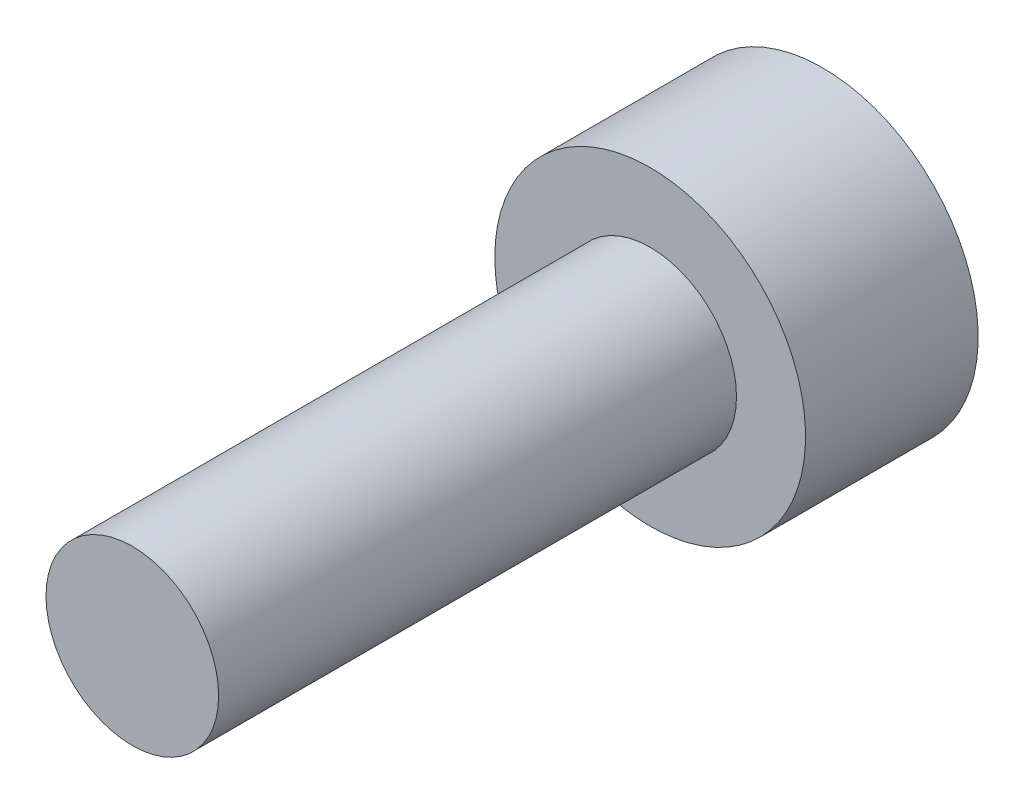
ISO-10303-21;
HEADER;
FILE_DESCRIPTION(('STEP AP214'),'2;1');
FILE_NAME('part.step','',(''),(''),'','','');
FILE_SCHEMA(('AUTOMOTIVE_DESIGN { 1 0 10303 214 1 1 1 1 }'));
ENDSEC;
DATA;
#1=APPLICATION_CONTEXT('core data for automotive mechanical design processes');
#2=APPLICATION_PROTOCOL_DEFINITION('international standard','automotive_design',2000,#1);
#3=PRODUCT_CONTEXT('',#1,'mechanical');
#4=PRODUCT('Part','Part','',(#3));
#5=PRODUCT_RELATED_PRODUCT_CATEGORY('part','',(#4));
#6=PRODUCT_DEFINITION_FORMATION('','',#4);
#7=PRODUCT_DEFINITION_CONTEXT('part definition',#1,'design');
#8=PRODUCT_DEFINITION('design','',#6,#7);
#9=PRODUCT_DEFINITION_SHAPE('','',#8);
#10=(LENGTH_UNIT() NAMED_UNIT(*) SI_UNIT(.MILLI.,.METRE.));
#11=(NAMED_UNIT(*) PLANE_ANGLE_UNIT() SI_UNIT($,.RADIAN.));
#12=(NAMED_UNIT(*) SI_UNIT($,.STERADIAN.) SOLID_ANGLE_UNIT());
#13=UNCERTAINTY_MEASURE_WITH_UNIT(LENGTH_MEASURE(1.E-05),#10,'distance_accuracy_value','');
#14=(GEOMETRIC_REPRESENTATION_CONTEXT(3) GLOBAL_UNCERTAINTY_ASSIGNED_CONTEXT((#13)) GLOBAL_UNIT_ASSIGNED_CONTEXT((#10,
#11,#12)) REPRESENTATION_CONTEXT('',''));
#15=CARTESIAN_POINT('',(0.,0.,0.));
#16=DIRECTION('',(0.,0.,1.));
#17=DIRECTION('',(1.,0.,0.));
#18=AXIS2_PLACEMENT_3D('',#15,#16,#17);
#19=CARTESIAN_POINT('',(0.,0.,15.));
#20=DIRECTION('',(0.,0.,-1.));
#21=DIRECTION('',(-1.,0.,0.));
#22=AXIS2_PLACEMENT_3D('',#19,#20,#21);
#23=CYLINDRICAL_SURFACE('',#22,2.5);
#24=CARTESIAN_POINT('',(0.,0.,15.));
#25=DIRECTION('',(0.,0.,1.));
#26=DIRECTION('',(1.,0.,0.));
#27=AXIS2_PLACEMENT_3D('',#24,#25,#26);
#28=CIRCLE('',#27,2.5);
#29=CARTESIAN_POINT('',(2.5,0.,15.));
#30=VERTEX_POINT('',#29);
#31=EDGE_CURVE('E11',#30,#30,#28,.T.);
#32=ORIENTED_EDGE('',*,*,#31,.F.);
#33=EDGE_LOOP('',(#32));
#34=FACE_BOUND('',#33,.T.);
#35=CARTESIAN_POINT('',(0.,0.,0.));
#36=DIRECTION('',(0.,0.,-1.));
#37=DIRECTION('',(-1.,0.,0.));
#38=AXIS2_PLACEMENT_3D('',#35,#36,#37);
#39=CIRCLE('',#38,2.5);
#40=CARTESIAN_POINT('',(-2.5,0.,0.));
#41=VERTEX_POINT('',#40);
#42=EDGE_CURVE('E53',#41,#41,#39,.T.);
#43=ORIENTED_EDGE('',*,*,#42,.F.);
#44=EDGE_LOOP('',(#43));
#45=FACE_BOUND('',#44,.T.);
#46=ADVANCED_FACE('F45',(#34,#45),#23,.T.);
#47=CARTESIAN_POINT('',(0.,0.,15.));
#48=DIRECTION('',(0.,0.,1.));
#49=DIRECTION('',(1.,0.,0.));
#50=AXIS2_PLACEMENT_3D('',#47,#48,#49);
#51=PLANE('',#50);
#52=ORIENTED_EDGE('',*,*,#31,.T.);
#53=EDGE_LOOP('',(#52));
#54=FACE_BOUND('',#53,.T.);
#55=ADVANCED_FACE('F182',(#54),#51,.T.);
#56=CARTESIAN_POINT('',(0.,0.,0.));
#57=DIRECTION('',(0.,0.,-1.));
#58=DIRECTION('',(-1.,0.,0.));
#59=AXIS2_PLACEMENT_3D('',#56,#57,#58);
#60=PLANE('',#59);
#61=CARTESIAN_POINT('',(0.,0.,0.));
#62=DIRECTION('',(0.,0.,-1.));
#63=DIRECTION('',(-1.,0.,0.));
#64=AXIS2_PLACEMENT_3D('',#61,#62,#63);
#65=CIRCLE('',#64,4.5);
#66=CARTESIAN_POINT('',(-4.5,0.,0.));
#67=VERTEX_POINT('',#66);
#68=EDGE_CURVE('E160',#67,#67,#65,.T.);
#69=ORIENTED_EDGE('',*,*,#68,.F.);
#70=EDGE_LOOP('',(#69));
#71=FACE_BOUND('',#70,.T.);
#72=ORIENTED_EDGE('',*,*,#42,.T.);
#73=EDGE_LOOP('',(#72));
#74=FACE_BOUND('',#73,.T.);
#75=ADVANCED_FACE('F179',(#71,#74),#60,.F.);
#76=CARTESIAN_POINT('',(0.,0.,-5.));
#77=DIRECTION('',(0.,0.,1.));
#78=DIRECTION('',(1.,0.,0.));
#79=AXIS2_PLACEMENT_3D('',#76,#77,#78);
#80=CYLINDRICAL_SURFACE('',#79,4.5);
#81=CARTESIAN_POINT('',(0.,0.,-5.));
#82=DIRECTION('',(0.,0.,-1.));
#83=DIRECTION('',(-1.,0.,0.));
#84=AXIS2_PLACEMENT_3D('',#81,#82,#83);
#85=CIRCLE('',#84,4.5);
#86=CARTESIAN_POINT('',(-4.5,0.,-5.));
#87=VERTEX_POINT('',#86);
#88=EDGE_CURVE('E170',#87,#87,#85,.T.);
#89=ORIENTED_EDGE('',*,*,#88,.F.);
#90=EDGE_LOOP('',(#89));
#91=FACE_BOUND('',#90,.T.);
#92=ORIENTED_EDGE('',*,*,#68,.T.);
#93=EDGE_LOOP('',(#92));
#94=FACE_BOUND('',#93,.T.);
#95=ADVANCED_FACE('F192',(#91,#94),#80,.T.);
#96=CARTESIAN_POINT('',(0.,0.,-5.));
#97=DIRECTION('',(0.,0.,-1.));
#98=DIRECTION('',(-1.,0.,0.));
#99=AXIS2_PLACEMENT_3D('',#96,#97,#98);
#100=PLANE('',#99);
#101=DIRECTION('',(0.866025403784439,0.5,0.));
#102=VECTOR('',#101,1.);
#103=CARTESIAN_POINT('',(-2.5,1.44337567297407,-5.));
#104=LINE('',#103,#102);
#105=CARTESIAN_POINT('',(-2.5,1.44337567297407,-5.));
#106=VERTEX_POINT('',#105);
#107=CARTESIAN_POINT('',(0.,2.88675134594813,-5.));
#108=VERTEX_POINT('',#107);
#109=EDGE_CURVE('E60',#106,#108,#104,.T.);
#110=ORIENTED_EDGE('',*,*,#109,.F.);
#111=DIRECTION('',(0.,1.,0.));
#112=VECTOR('',#111,1.);
#113=CARTESIAN_POINT('',(-2.5,-1.44337567297407,-5.));
#114=LINE('',#113,#112);
#115=CARTESIAN_POINT('',(-2.5,-1.44337567297407,-5.));
#116=VERTEX_POINT('',#115);
#117=EDGE_CURVE('E154',#116,#106,#114,.T.);
#118=ORIENTED_EDGE('',*,*,#117,.F.);
#119=DIRECTION('',(-0.866025403784439,0.5,0.));
#120=VECTOR('',#119,1.);
#121=CARTESIAN_POINT('',(0.,-2.88675134594813,-5.));
#122=LINE('',#121,#120);
#123=CARTESIAN_POINT('',(0.,-2.88675134594813,-5.));
#124=VERTEX_POINT('',#123);
#125=EDGE_CURVE('E151',#124,#116,#122,.T.);
#126=ORIENTED_EDGE('',*,*,#125,.F.);
#127=DIRECTION('',(-0.866025403784439,-0.5,0.));
#128=VECTOR('',#127,1.);
#129=CARTESIAN_POINT('',(2.5,-1.44337567297407,-5.));
#130=LINE('',#129,#128);
#131=CARTESIAN_POINT('',(2.5,-1.44337567297407,-5.));
#132=VERTEX_POINT('',#131);
#133=EDGE_CURVE('E108',#132,#124,#130,.T.);
#134=ORIENTED_EDGE('',*,*,#133,.F.);
#135=DIRECTION('',(0.,-1.,0.));
#136=VECTOR('',#135,1.);
#137=CARTESIAN_POINT('',(2.5,1.44337567297406,-5.));
#138=LINE('',#137,#136);
#139=CARTESIAN_POINT('',(2.5,1.44337567297406,-5.));
#140=VERTEX_POINT('',#139);
#141=EDGE_CURVE('E145',#140,#132,#138,.T.);
#142=ORIENTED_EDGE('',*,*,#141,.F.);
#143=DIRECTION('',(0.866025403784439,-0.5,0.));
#144=VECTOR('',#143,1.);
#145=CARTESIAN_POINT('',(0.,2.88675134594813,-5.));
#146=LINE('',#145,#144);
#147=EDGE_CURVE('E141',#108,#140,#146,.T.);
#148=ORIENTED_EDGE('',*,*,#147,.F.);
#149=EDGE_LOOP('',(#110,#118,#126,#134,#142,#148));
#150=FACE_BOUND('',#149,.T.);
#151=ORIENTED_EDGE('',*,*,#88,.T.);
#152=EDGE_LOOP('',(#151));
#153=FACE_BOUND('',#152,.T.);
#154=ADVANCED_FACE('F197',(#150,#153),#100,.T.);
#155=CARTESIAN_POINT('',(-2.5,1.44337567297407,-2.1));
#156=DIRECTION('',(-0.5,0.866025403784439,0.));
#157=DIRECTION('',(-0.866025403784439,-0.5,0.));
#158=AXIS2_PLACEMENT_3D('',#155,#156,#157);
#159=PLANE('',#158);
#160=ORIENTED_EDGE('',*,*,#109,.T.);
#161=DIRECTION('',(0.,0.,-1.));
#162=VECTOR('',#161,1.);
#163=CARTESIAN_POINT('',(0.,2.88675134594813,-2.1));
#164=LINE('',#163,#162);
#165=CARTESIAN_POINT('',(0.,2.88675134594813,-2.1));
#166=VERTEX_POINT('',#165);
#167=EDGE_CURVE('E90',#166,#108,#164,.T.);
#168=ORIENTED_EDGE('',*,*,#167,.F.);
#169=DIRECTION('',(0.866025403784439,0.5,0.));
#170=VECTOR('',#169,1.);
#171=CARTESIAN_POINT('',(-2.5,1.44337567297407,-2.1));
#172=LINE('',#171,#170);
#173=CARTESIAN_POINT('',(-2.5,1.44337567297407,-2.1));
#174=VERTEX_POINT('',#173);
#175=EDGE_CURVE('E157',#174,#166,#172,.T.);
#176=ORIENTED_EDGE('',*,*,#175,.F.);
#177=DIRECTION('',(0.,0.,-1.));
#178=VECTOR('',#177,1.);
#179=CARTESIAN_POINT('',(-2.5,1.44337567297407,-2.1));
#180=LINE('',#179,#178);
#181=EDGE_CURVE('E68',#174,#106,#180,.T.);
#182=ORIENTED_EDGE('',*,*,#181,.T.);
#183=EDGE_LOOP('',(#160,#168,#176,#182));
#184=FACE_BOUND('',#183,.T.);
#185=ADVANCED_FACE('F202',(#184),#159,.F.);
#186=CARTESIAN_POINT('',(-2.5,-1.44337567297407,-2.1));
#187=DIRECTION('',(-1.,0.,0.));
#188=DIRECTION('',(0.,-1.,0.));
#189=AXIS2_PLACEMENT_3D('',#186,#187,#188);
#190=PLANE('',#189);
#191=ORIENTED_EDGE('',*,*,#117,.T.);
#192=ORIENTED_EDGE('',*,*,#181,.F.);
#193=DIRECTION('',(0.,1.,0.));
#194=VECTOR('',#193,1.);
#195=CARTESIAN_POINT('',(-2.5,-1.44337567297407,-2.1));
#196=LINE('',#195,#194);
#197=CARTESIAN_POINT('',(-2.5,-1.44337567297407,-2.1));
#198=VERTEX_POINT('',#197);
#199=EDGE_CURVE('E122',#198,#174,#196,.T.);
#200=ORIENTED_EDGE('',*,*,#199,.F.);
#201=DIRECTION('',(0.,0.,-1.));
#202=VECTOR('',#201,1.);
#203=CARTESIAN_POINT('',(-2.5,-1.44337567297407,-2.1));
#204=LINE('',#203,#202);
#205=EDGE_CURVE('E113',#198,#116,#204,.T.);
#206=ORIENTED_EDGE('',*,*,#205,.T.);
#207=EDGE_LOOP('',(#191,#192,#200,#206));
#208=FACE_BOUND('',#207,.T.);
#209=ADVANCED_FACE('F206',(#208),#190,.F.);
#210=CARTESIAN_POINT('',(0.,-2.88675134594813,-2.1));
#211=DIRECTION('',(-0.5,-0.866025403784439,0.));
#212=DIRECTION('',(0.866025403784439,-0.5,0.));
#213=AXIS2_PLACEMENT_3D('',#210,#211,#212);
#214=PLANE('',#213);
#215=ORIENTED_EDGE('',*,*,#125,.T.);
#216=ORIENTED_EDGE('',*,*,#205,.F.);
#217=DIRECTION('',(-0.866025403784439,0.5,0.));
#218=VECTOR('',#217,1.);
#219=CARTESIAN_POINT('',(0.,-2.88675134594813,-2.1));
#220=LINE('',#219,#218);
#221=CARTESIAN_POINT('',(0.,-2.88675134594813,-2.1));
#222=VERTEX_POINT('',#221);
#223=EDGE_CURVE('E117',#222,#198,#220,.T.);
#224=ORIENTED_EDGE('',*,*,#223,.F.);
#225=DIRECTION('',(0.,0.,-1.));
#226=VECTOR('',#225,1.);
#227=CARTESIAN_POINT('',(0.,-2.88675134594813,-2.1));
#228=LINE('',#227,#226);
#229=EDGE_CURVE('E101',#222,#124,#228,.T.);
#230=ORIENTED_EDGE('',*,*,#229,.T.);
#231=EDGE_LOOP('',(#215,#216,#224,#230));
#232=FACE_BOUND('',#231,.T.);
#233=ADVANCED_FACE('F118',(#232),#214,.F.);
#234=CARTESIAN_POINT('',(2.5,-1.44337567297407,-2.1));
#235=DIRECTION('',(0.5,-0.866025403784439,0.));
#236=DIRECTION('',(0.866025403784439,0.5,0.));
#237=AXIS2_PLACEMENT_3D('',#234,#235,#236);
#238=PLANE('',#237);
#239=ORIENTED_EDGE('',*,*,#133,.T.);
#240=ORIENTED_EDGE('',*,*,#229,.F.);
#241=DIRECTION('',(-0.866025403784439,-0.5,0.));
#242=VECTOR('',#241,1.);
#243=CARTESIAN_POINT('',(2.5,-1.44337567297407,-2.1));
#244=LINE('',#243,#242);
#245=CARTESIAN_POINT('',(2.5,-1.44337567297407,-2.1));
#246=VERTEX_POINT('',#245);
#247=EDGE_CURVE('E105',#246,#222,#244,.T.);
#248=ORIENTED_EDGE('',*,*,#247,.F.);
#249=DIRECTION('',(0.,0.,-1.));
#250=VECTOR('',#249,1.);
#251=CARTESIAN_POINT('',(2.5,-1.44337567297407,-2.1));
#252=LINE('',#251,#250);
#253=EDGE_CURVE('E114',#246,#132,#252,.T.);
#254=ORIENTED_EDGE('',*,*,#253,.T.);
#255=EDGE_LOOP('',(#239,#240,#248,#254));
#256=FACE_BOUND('',#255,.T.);
#257=ADVANCED_FACE('F103',(#256),#238,.F.);
#258=CARTESIAN_POINT('',(2.5,1.44337567297406,-2.1));
#259=DIRECTION('',(1.,0.,0.));
#260=DIRECTION('',(0.,1.,0.));
#261=AXIS2_PLACEMENT_3D('',#258,#259,#260);
#262=PLANE('',#261);
#263=ORIENTED_EDGE('',*,*,#141,.T.);
#264=ORIENTED_EDGE('',*,*,#253,.F.);
#265=DIRECTION('',(0.,-1.,0.));
#266=VECTOR('',#265,1.);
#267=CARTESIAN_POINT('',(2.5,1.44337567297406,-2.1));
#268=LINE('',#267,#266);
#269=CARTESIAN_POINT('',(2.5,1.44337567297406,-2.1));
#270=VERTEX_POINT('',#269);
#271=EDGE_CURVE('E128',#270,#246,#268,.T.);
#272=ORIENTED_EDGE('',*,*,#271,.F.);
#273=DIRECTION('',(0.,0.,-1.));
#274=VECTOR('',#273,1.);
#275=CARTESIAN_POINT('',(2.5,1.44337567297406,-2.1));
#276=LINE('',#275,#274);
#277=EDGE_CURVE('E165',#270,#140,#276,.T.);
#278=ORIENTED_EDGE('',*,*,#277,.T.);
#279=EDGE_LOOP('',(#263,#264,#272,#278));
#280=FACE_BOUND('',#279,.T.);
#281=ADVANCED_FACE('F210',(#280),#262,.F.);
#282=CARTESIAN_POINT('',(0.,2.88675134594813,-2.1));
#283=DIRECTION('',(0.5,0.866025403784439,0.));
#284=DIRECTION('',(-0.866025403784439,0.5,0.));
#285=AXIS2_PLACEMENT_3D('',#282,#283,#284);
#286=PLANE('',#285);
#287=ORIENTED_EDGE('',*,*,#147,.T.);
#288=ORIENTED_EDGE('',*,*,#277,.F.);
#289=DIRECTION('',(0.866025403784439,-0.5,0.));
#290=VECTOR('',#289,1.);
#291=CARTESIAN_POINT('',(0.,2.88675134594813,-2.1));
#292=LINE('',#291,#290);
#293=EDGE_CURVE('E134',#166,#270,#292,.T.);
#294=ORIENTED_EDGE('',*,*,#293,.F.);
#295=ORIENTED_EDGE('',*,*,#167,.T.);
#296=EDGE_LOOP('',(#287,#288,#294,#295));
#297=FACE_BOUND('',#296,.T.);
#298=ADVANCED_FACE('F207',(#297),#286,.F.);
#299=CARTESIAN_POINT('',(0.,0.,-2.1));
#300=DIRECTION('',(0.,0.,-1.));
#301=DIRECTION('',(-1.,0.,0.));
#302=AXIS2_PLACEMENT_3D('',#299,#300,#301);
#303=PLANE('',#302);
#304=ORIENTED_EDGE('',*,*,#175,.T.);
#305=ORIENTED_EDGE('',*,*,#293,.T.);
#306=ORIENTED_EDGE('',*,*,#271,.T.);
#307=ORIENTED_EDGE('',*,*,#247,.T.);
#308=ORIENTED_EDGE('',*,*,#223,.T.);
#309=ORIENTED_EDGE('',*,*,#199,.T.);
#310=EDGE_LOOP('',(#304,#305,#306,#307,#308,#309));
#311=FACE_BOUND('',#310,.T.);
#312=ADVANCED_FACE('F125',(#311),#303,.T.);
#313=CLOSED_SHELL('',(#46,#55,#75,#95,#154,#185,#209,#233,#257,#281,#298,#312));
#314=MANIFOLD_SOLID_BREP('B2',#313);
#315=ADVANCED_BREP_SHAPE_REPRESENTATION('',(#18,#314),#14);
#316=SHAPE_DEFINITION_REPRESENTATION(#9,#315);
ENDSEC;
END-ISO-10303-21;
